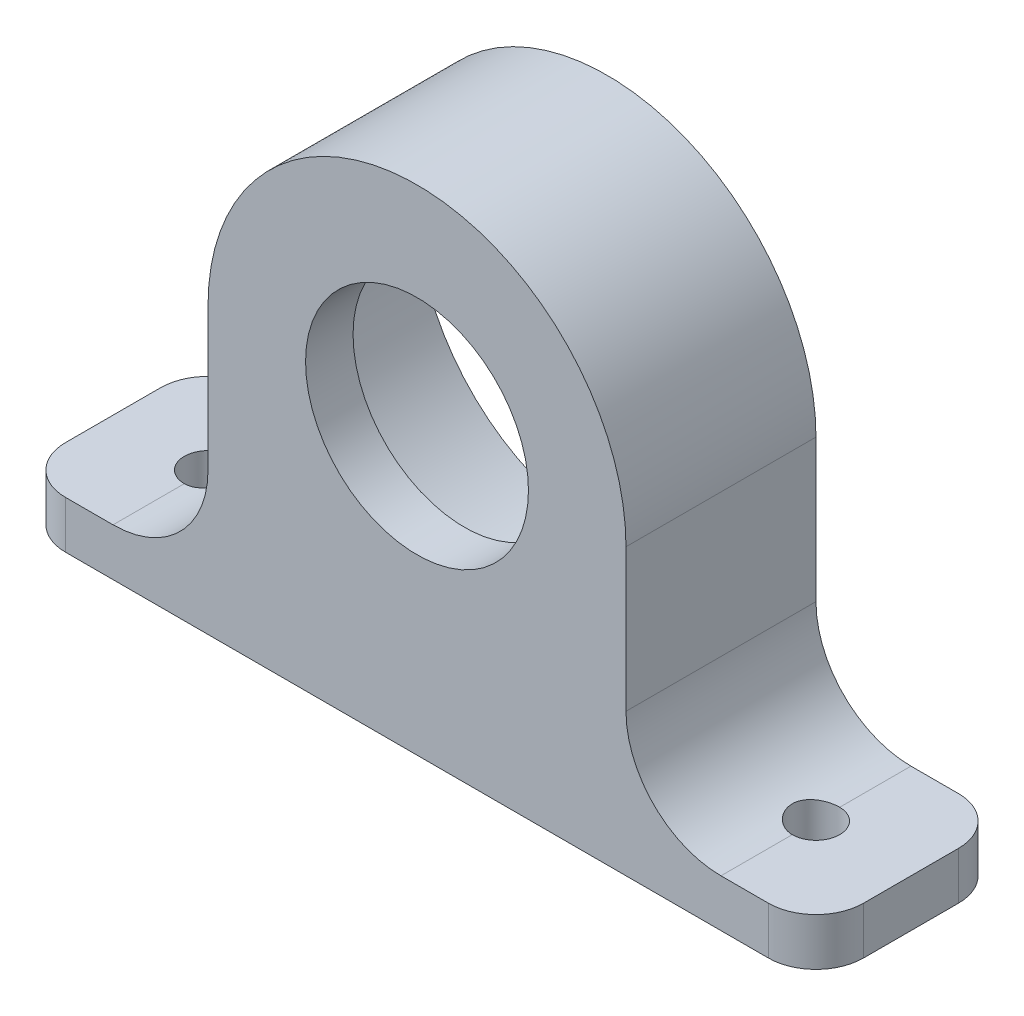
ISO-10303-21;
HEADER;
FILE_DESCRIPTION(('STEP AP214'),'2;1');
FILE_NAME('part.step','',(''),(''),'','','');
FILE_SCHEMA(('AUTOMOTIVE_DESIGN { 1 0 10303 214 1 1 1 1 }'));
ENDSEC;
DATA;
#1=APPLICATION_CONTEXT('core data for automotive mechanical design processes');
#2=APPLICATION_PROTOCOL_DEFINITION('international standard','automotive_design',2000,#1);
#3=PRODUCT_CONTEXT('',#1,'mechanical');
#4=PRODUCT('Part','Part','',(#3));
#5=PRODUCT_RELATED_PRODUCT_CATEGORY('part','',(#4));
#6=PRODUCT_DEFINITION_FORMATION('','',#4);
#7=PRODUCT_DEFINITION_CONTEXT('part definition',#1,'design');
#8=PRODUCT_DEFINITION('design','',#6,#7);
#9=PRODUCT_DEFINITION_SHAPE('','',#8);
#10=(LENGTH_UNIT() NAMED_UNIT(*) SI_UNIT(.MILLI.,.METRE.));
#11=(NAMED_UNIT(*) PLANE_ANGLE_UNIT() SI_UNIT($,.RADIAN.));
#12=(NAMED_UNIT(*) SI_UNIT($,.STERADIAN.) SOLID_ANGLE_UNIT());
#13=UNCERTAINTY_MEASURE_WITH_UNIT(LENGTH_MEASURE(1.E-05),#10,'distance_accuracy_value','');
#14=(GEOMETRIC_REPRESENTATION_CONTEXT(3) GLOBAL_UNCERTAINTY_ASSIGNED_CONTEXT((#13)) GLOBAL_UNIT_ASSIGNED_CONTEXT((#10,
#11,#12)) REPRESENTATION_CONTEXT('',''));
#15=CARTESIAN_POINT('',(0.,0.,0.));
#16=DIRECTION('',(0.,0.,1.));
#17=DIRECTION('',(1.,0.,0.));
#18=AXIS2_PLACEMENT_3D('',#15,#16,#17);
#19=CARTESIAN_POINT('',(0.,30.,20.));
#20=DIRECTION('',(0.,0.,-1.));
#21=DIRECTION('',(-1.,0.,0.));
#22=AXIS2_PLACEMENT_3D('',#19,#20,#21);
#23=CYLINDRICAL_SURFACE('',#22,20.);
#24=CARTESIAN_POINT('',(0.,30.,0.));
#25=DIRECTION('',(0.,0.,1.));
#26=DIRECTION('',(1.,0.,0.));
#27=AXIS2_PLACEMENT_3D('',#24,#25,#26);
#28=CIRCLE('',#27,20.);
#29=CARTESIAN_POINT('',(20.,30.,0.));
#30=VERTEX_POINT('',#29);
#31=EDGE_CURVE('E206',#30,#30,#28,.T.);
#32=ORIENTED_EDGE('',*,*,#31,.F.);
#33=EDGE_LOOP('',(#32));
#34=FACE_BOUND('',#33,.T.);
#35=CARTESIAN_POINT('',(0.,30.,15.));
#36=DIRECTION('',(0.,0.,1.));
#37=DIRECTION('',(1.,0.,0.));
#38=AXIS2_PLACEMENT_3D('',#35,#36,#37);
#39=CIRCLE('',#38,20.);
#40=CARTESIAN_POINT('',(20.,30.,15.));
#41=VERTEX_POINT('',#40);
#42=EDGE_CURVE('E406',#41,#41,#39,.T.);
#43=ORIENTED_EDGE('',*,*,#42,.T.);
#44=EDGE_LOOP('',(#43));
#45=FACE_BOUND('',#44,.T.);
#46=ADVANCED_FACE('F51',(#34,#45),#23,.F.);
#47=CARTESIAN_POINT('',(0.,30.,20.));
#48=DIRECTION('',(0.,0.,-1.));
#49=DIRECTION('',(-1.,0.,0.));
#50=AXIS2_PLACEMENT_3D('',#47,#48,#49);
#51=PLANE('',#50);
#52=DIRECTION('',(1.,0.,0.));
#53=VECTOR('',#52,1.);
#54=CARTESIAN_POINT('',(42.,0.,20.));
#55=LINE('',#54,#53);
#56=CARTESIAN_POINT('',(-37.,0.,20.));
#57=VERTEX_POINT('',#56);
#58=CARTESIAN_POINT('',(37.,0.,20.));
#59=VERTEX_POINT('',#58);
#60=EDGE_CURVE('E201',#57,#59,#55,.T.);
#61=ORIENTED_EDGE('',*,*,#60,.T.);
#62=DIRECTION('',(0.,1.,0.));
#63=VECTOR('',#62,1.);
#64=CARTESIAN_POINT('',(37.,30.,20.));
#65=LINE('',#64,#63);
#66=CARTESIAN_POINT('',(37.,5.,20.));
#67=VERTEX_POINT('',#66);
#68=EDGE_CURVE('E11',#59,#67,#65,.T.);
#69=ORIENTED_EDGE('',*,*,#68,.T.);
#70=DIRECTION('',(-1.,0.,0.));
#71=VECTOR('',#70,1.);
#72=CARTESIAN_POINT('',(42.,5.,20.));
#73=LINE('',#72,#71);
#74=CARTESIAN_POINT('',(32.,5.,20.));
#75=VERTEX_POINT('',#74);
#76=EDGE_CURVE('E178',#67,#75,#73,.T.);
#77=ORIENTED_EDGE('',*,*,#76,.T.);
#78=CARTESIAN_POINT('',(32.,15.,20.));
#79=DIRECTION('',(0.,0.,-1.));
#80=DIRECTION('',(-1.,0.,0.));
#81=AXIS2_PLACEMENT_3D('',#78,#79,#80);
#82=CIRCLE('',#81,10.);
#83=CARTESIAN_POINT('',(22.,15.,20.));
#84=VERTEX_POINT('',#83);
#85=EDGE_CURVE('E174',#75,#84,#82,.T.);
#86=ORIENTED_EDGE('',*,*,#85,.T.);
#87=DIRECTION('',(0.,1.,0.));
#88=VECTOR('',#87,1.);
#89=CARTESIAN_POINT('',(22.,5.,20.));
#90=LINE('',#89,#88);
#91=CARTESIAN_POINT('',(22.,30.,20.));
#92=VERTEX_POINT('',#91);
#93=EDGE_CURVE('E164',#84,#92,#90,.T.);
#94=ORIENTED_EDGE('',*,*,#93,.T.);
#95=CARTESIAN_POINT('',(0.,30.,20.));
#96=DIRECTION('',(0.,0.,1.));
#97=DIRECTION('',(-1.,0.,0.));
#98=AXIS2_PLACEMENT_3D('',#95,#96,#97);
#99=CIRCLE('',#98,22.);
#100=CARTESIAN_POINT('',(-22.,30.,20.));
#101=VERTEX_POINT('',#100);
#102=EDGE_CURVE('E171',#92,#101,#99,.T.);
#103=ORIENTED_EDGE('',*,*,#102,.T.);
#104=DIRECTION('',(0.,-1.,0.));
#105=VECTOR('',#104,1.);
#106=CARTESIAN_POINT('',(-22.,4.99999999999999,20.));
#107=LINE('',#106,#105);
#108=CARTESIAN_POINT('',(-22.,15.,20.));
#109=VERTEX_POINT('',#108);
#110=EDGE_CURVE('E193',#101,#109,#107,.T.);
#111=ORIENTED_EDGE('',*,*,#110,.T.);
#112=CARTESIAN_POINT('',(-32.,15.,20.));
#113=DIRECTION('',(0.,0.,-1.));
#114=DIRECTION('',(-1.,0.,0.));
#115=AXIS2_PLACEMENT_3D('',#112,#113,#114);
#116=CIRCLE('',#115,10.);
#117=CARTESIAN_POINT('',(-32.,4.99999999999999,20.));
#118=VERTEX_POINT('',#117);
#119=EDGE_CURVE('E389',#109,#118,#116,.T.);
#120=ORIENTED_EDGE('',*,*,#119,.T.);
#121=DIRECTION('',(-1.,0.,0.));
#122=VECTOR('',#121,1.);
#123=CARTESIAN_POINT('',(-42.,4.99999999999999,20.));
#124=LINE('',#123,#122);
#125=CARTESIAN_POINT('',(-37.,4.99999999999999,20.));
#126=VERTEX_POINT('',#125);
#127=EDGE_CURVE('E195',#118,#126,#124,.T.);
#128=ORIENTED_EDGE('',*,*,#127,.T.);
#129=DIRECTION('',(0.,-1.,0.));
#130=VECTOR('',#129,1.);
#131=CARTESIAN_POINT('',(-37.,30.,20.));
#132=LINE('',#131,#130);
#133=EDGE_CURVE('E59',#126,#57,#132,.T.);
#134=ORIENTED_EDGE('',*,*,#133,.T.);
#135=EDGE_LOOP('',(#61,#69,#77,#86,#94,#103,#111,#120,#128,#134));
#136=FACE_BOUND('',#135,.T.);
#137=CARTESIAN_POINT('',(0.,30.,20.));
#138=DIRECTION('',(0.,0.,1.));
#139=DIRECTION('',(1.,0.,0.));
#140=AXIS2_PLACEMENT_3D('',#137,#138,#139);
#141=CIRCLE('',#140,11.7327485907351);
#142=CARTESIAN_POINT('',(11.7327485907351,30.,20.));
#143=VERTEX_POINT('',#142);
#144=EDGE_CURVE('E560',#143,#143,#141,.T.);
#145=ORIENTED_EDGE('',*,*,#144,.F.);
#146=EDGE_LOOP('',(#145));
#147=FACE_BOUND('',#146,.T.);
#148=ADVANCED_FACE('F167',(#136,#147),#51,.F.);
#149=CARTESIAN_POINT('',(0.,30.,0.));
#150=DIRECTION('',(0.,0.,-1.));
#151=DIRECTION('',(-1.,0.,0.));
#152=AXIS2_PLACEMENT_3D('',#149,#150,#151);
#153=PLANE('',#152);
#154=DIRECTION('',(1.,0.,0.));
#155=VECTOR('',#154,1.);
#156=CARTESIAN_POINT('',(42.,0.,0.));
#157=LINE('',#156,#155);
#158=CARTESIAN_POINT('',(-37.,0.,0.));
#159=VERTEX_POINT('',#158);
#160=CARTESIAN_POINT('',(37.,0.,0.));
#161=VERTEX_POINT('',#160);
#162=EDGE_CURVE('E216',#159,#161,#157,.T.);
#163=ORIENTED_EDGE('',*,*,#162,.F.);
#164=DIRECTION('',(0.,-1.,0.));
#165=VECTOR('',#164,1.);
#166=CARTESIAN_POINT('',(-37.,4.99999999999999,0.));
#167=LINE('',#166,#165);
#168=CARTESIAN_POINT('',(-37.,4.99999999999999,0.));
#169=VERTEX_POINT('',#168);
#170=EDGE_CURVE('E384',#159,#169,#167,.F.);
#171=ORIENTED_EDGE('',*,*,#170,.T.);
#172=DIRECTION('',(-1.,0.,0.));
#173=VECTOR('',#172,1.);
#174=CARTESIAN_POINT('',(-42.,4.99999999999999,0.));
#175=LINE('',#174,#173);
#176=CARTESIAN_POINT('',(-32.,4.99999999999999,0.));
#177=VERTEX_POINT('',#176);
#178=EDGE_CURVE('E213',#177,#169,#175,.T.);
#179=ORIENTED_EDGE('',*,*,#178,.F.);
#180=CARTESIAN_POINT('',(-32.,15.,0.));
#181=DIRECTION('',(0.,0.,-1.));
#182=DIRECTION('',(-1.,0.,0.));
#183=AXIS2_PLACEMENT_3D('',#180,#181,#182);
#184=CIRCLE('',#183,10.);
#185=CARTESIAN_POINT('',(-22.,15.,0.));
#186=VERTEX_POINT('',#185);
#187=EDGE_CURVE('E289',#177,#186,#184,.F.);
#188=ORIENTED_EDGE('',*,*,#187,.T.);
#189=DIRECTION('',(0.,-1.,0.));
#190=VECTOR('',#189,1.);
#191=CARTESIAN_POINT('',(-22.,4.99999999999999,0.));
#192=LINE('',#191,#190);
#193=CARTESIAN_POINT('',(-22.,30.,0.));
#194=VERTEX_POINT('',#193);
#195=EDGE_CURVE('E210',#194,#186,#192,.T.);
#196=ORIENTED_EDGE('',*,*,#195,.F.);
#197=CARTESIAN_POINT('',(0.,30.,0.));
#198=DIRECTION('',(0.,0.,1.));
#199=DIRECTION('',(-1.,0.,0.));
#200=AXIS2_PLACEMENT_3D('',#197,#198,#199);
#201=CIRCLE('',#200,22.);
#202=CARTESIAN_POINT('',(22.,30.,0.));
#203=VERTEX_POINT('',#202);
#204=EDGE_CURVE('E208',#203,#194,#201,.T.);
#205=ORIENTED_EDGE('',*,*,#204,.F.);
#206=DIRECTION('',(0.,1.,0.));
#207=VECTOR('',#206,1.);
#208=CARTESIAN_POINT('',(22.,5.,0.));
#209=LINE('',#208,#207);
#210=CARTESIAN_POINT('',(22.,15.,0.));
#211=VERTEX_POINT('',#210);
#212=EDGE_CURVE('E184',#211,#203,#209,.T.);
#213=ORIENTED_EDGE('',*,*,#212,.F.);
#214=CARTESIAN_POINT('',(32.,15.,0.));
#215=DIRECTION('',(0.,0.,-1.));
#216=DIRECTION('',(-1.,0.,0.));
#217=AXIS2_PLACEMENT_3D('',#214,#215,#216);
#218=CIRCLE('',#217,10.);
#219=CARTESIAN_POINT('',(32.,5.,0.));
#220=VERTEX_POINT('',#219);
#221=EDGE_CURVE('E251',#211,#220,#218,.F.);
#222=ORIENTED_EDGE('',*,*,#221,.T.);
#223=DIRECTION('',(-1.,0.,0.));
#224=VECTOR('',#223,1.);
#225=CARTESIAN_POINT('',(42.,5.,0.));
#226=LINE('',#225,#224);
#227=CARTESIAN_POINT('',(37.,5.,0.));
#228=VERTEX_POINT('',#227);
#229=EDGE_CURVE('E204',#228,#220,#226,.T.);
#230=ORIENTED_EDGE('',*,*,#229,.F.);
#231=DIRECTION('',(0.,1.,0.));
#232=VECTOR('',#231,1.);
#233=CARTESIAN_POINT('',(37.,0.,0.));
#234=LINE('',#233,#232);
#235=EDGE_CURVE('E382',#228,#161,#234,.F.);
#236=ORIENTED_EDGE('',*,*,#235,.T.);
#237=EDGE_LOOP('',(#163,#171,#179,#188,#196,#205,#213,#222,#230,#236));
#238=FACE_BOUND('',#237,.T.);
#239=ORIENTED_EDGE('',*,*,#31,.T.);
#240=EDGE_LOOP('',(#239));
#241=FACE_BOUND('',#240,.T.);
#242=ADVANCED_FACE('F311',(#238,#241),#153,.T.);
#243=CARTESIAN_POINT('',(42.,5.,20.));
#244=DIRECTION('',(0.,-1.,0.));
#245=DIRECTION('',(1.,0.,0.));
#246=AXIS2_PLACEMENT_3D('',#243,#244,#245);
#247=PLANE('',#246);
#248=DIRECTION('',(0.,0.,-1.));
#249=VECTOR('',#248,1.);
#250=CARTESIAN_POINT('',(42.,5.,20.));
#251=LINE('',#250,#249);
#252=CARTESIAN_POINT('',(42.,5.,15.));
#253=VERTEX_POINT('',#252);
#254=CARTESIAN_POINT('',(42.,5.,5.));
#255=VERTEX_POINT('',#254);
#256=EDGE_CURVE('E203',#253,#255,#251,.T.);
#257=ORIENTED_EDGE('',*,*,#256,.T.);
#258=CARTESIAN_POINT('',(37.,5.,5.));
#259=DIRECTION('',(0.,-1.,0.));
#260=DIRECTION('',(1.,0.,0.));
#261=AXIS2_PLACEMENT_3D('',#258,#259,#260);
#262=CIRCLE('',#261,5.);
#263=EDGE_CURVE('E73',#255,#228,#262,.F.);
#264=ORIENTED_EDGE('',*,*,#263,.T.);
#265=ORIENTED_EDGE('',*,*,#229,.T.);
#266=DIRECTION('',(0.,0.,-1.));
#267=VECTOR('',#266,1.);
#268=CARTESIAN_POINT('',(32.,5.,20.));
#269=LINE('',#268,#267);
#270=CARTESIAN_POINT('',(32.,5.,7.49999999999999));
#271=VERTEX_POINT('',#270);
#272=EDGE_CURVE('E242',#220,#271,#269,.F.);
#273=ORIENTED_EDGE('',*,*,#272,.T.);
#274=CARTESIAN_POINT('',(32.,5.,9.99999999999999));
#275=DIRECTION('',(0.,1.,0.));
#276=DIRECTION('',(1.,0.,0.));
#277=AXIS2_PLACEMENT_3D('',#274,#275,#276);
#278=CIRCLE('',#277,2.5);
#279=CARTESIAN_POINT('',(32.,5.,12.5));
#280=VERTEX_POINT('',#279);
#281=EDGE_CURVE('E403',#280,#271,#278,.T.);
#282=ORIENTED_EDGE('',*,*,#281,.F.);
#283=DIRECTION('',(0.,0.,-1.));
#284=VECTOR('',#283,1.);
#285=CARTESIAN_POINT('',(32.,5.,20.));
#286=LINE('',#285,#284);
#287=EDGE_CURVE('E239',#280,#75,#286,.F.);
#288=ORIENTED_EDGE('',*,*,#287,.T.);
#289=ORIENTED_EDGE('',*,*,#76,.F.);
#290=CARTESIAN_POINT('',(37.,5.,15.));
#291=DIRECTION('',(0.,-1.,0.));
#292=DIRECTION('',(1.,0.,0.));
#293=AXIS2_PLACEMENT_3D('',#290,#291,#292);
#294=CIRCLE('',#293,5.);
#295=EDGE_CURVE('E66',#67,#253,#294,.F.);
#296=ORIENTED_EDGE('',*,*,#295,.T.);
#297=EDGE_LOOP('',(#257,#264,#265,#273,#282,#288,#289,#296));
#298=FACE_BOUND('',#297,.T.);
#299=ADVANCED_FACE('F275',(#298),#247,.F.);
#300=CARTESIAN_POINT('',(22.,5.,20.));
#301=DIRECTION('',(-1.,0.,0.));
#302=DIRECTION('',(0.,0.,1.));
#303=AXIS2_PLACEMENT_3D('',#300,#301,#302);
#304=PLANE('',#303);
#305=ORIENTED_EDGE('',*,*,#93,.F.);
#306=DIRECTION('',(0.,0.,-1.));
#307=VECTOR('',#306,1.);
#308=CARTESIAN_POINT('',(22.,15.,0.));
#309=LINE('',#308,#307);
#310=EDGE_CURVE('E187',#84,#211,#309,.T.);
#311=ORIENTED_EDGE('',*,*,#310,.T.);
#312=ORIENTED_EDGE('',*,*,#212,.T.);
#313=DIRECTION('',(0.,0.,-1.));
#314=VECTOR('',#313,1.);
#315=CARTESIAN_POINT('',(22.,30.,20.));
#316=LINE('',#315,#314);
#317=EDGE_CURVE('E181',#92,#203,#316,.T.);
#318=ORIENTED_EDGE('',*,*,#317,.F.);
#319=EDGE_LOOP('',(#305,#311,#312,#318));
#320=FACE_BOUND('',#319,.T.);
#321=ADVANCED_FACE('F182',(#320),#304,.F.);
#322=CARTESIAN_POINT('',(0.,30.,20.));
#323=DIRECTION('',(0.,0.,-1.));
#324=DIRECTION('',(-1.,0.,0.));
#325=AXIS2_PLACEMENT_3D('',#322,#323,#324);
#326=CYLINDRICAL_SURFACE('',#325,22.);
#327=ORIENTED_EDGE('',*,*,#204,.T.);
#328=DIRECTION('',(0.,0.,-1.));
#329=VECTOR('',#328,1.);
#330=CARTESIAN_POINT('',(-22.,30.,20.));
#331=LINE('',#330,#329);
#332=EDGE_CURVE('E188',#101,#194,#331,.T.);
#333=ORIENTED_EDGE('',*,*,#332,.F.);
#334=ORIENTED_EDGE('',*,*,#102,.F.);
#335=ORIENTED_EDGE('',*,*,#317,.T.);
#336=EDGE_LOOP('',(#327,#333,#334,#335));
#337=FACE_BOUND('',#336,.T.);
#338=ADVANCED_FACE('F190',(#337),#326,.T.);
#339=CARTESIAN_POINT('',(-22.,4.99999999999999,20.));
#340=DIRECTION('',(1.,0.,0.));
#341=DIRECTION('',(0.,1.,0.));
#342=AXIS2_PLACEMENT_3D('',#339,#340,#341);
#343=PLANE('',#342);
#344=ORIENTED_EDGE('',*,*,#195,.T.);
#345=DIRECTION('',(0.,0.,-1.));
#346=VECTOR('',#345,1.);
#347=CARTESIAN_POINT('',(-22.,15.,20.));
#348=LINE('',#347,#346);
#349=EDGE_CURVE('E249',#186,#109,#348,.F.);
#350=ORIENTED_EDGE('',*,*,#349,.T.);
#351=ORIENTED_EDGE('',*,*,#110,.F.);
#352=ORIENTED_EDGE('',*,*,#332,.T.);
#353=EDGE_LOOP('',(#344,#350,#351,#352));
#354=FACE_BOUND('',#353,.T.);
#355=ADVANCED_FACE('F334',(#354),#343,.F.);
#356=CARTESIAN_POINT('',(-42.,4.99999999999999,20.));
#357=DIRECTION('',(0.,-1.,0.));
#358=DIRECTION('',(1.,0.,0.));
#359=AXIS2_PLACEMENT_3D('',#356,#357,#358);
#360=PLANE('',#359);
#361=ORIENTED_EDGE('',*,*,#178,.T.);
#362=CARTESIAN_POINT('',(-37.,4.99999999999999,5.));
#363=DIRECTION('',(0.,-1.,0.));
#364=DIRECTION('',(1.,0.,0.));
#365=AXIS2_PLACEMENT_3D('',#362,#363,#364);
#366=CIRCLE('',#365,5.);
#367=CARTESIAN_POINT('',(-42.,4.99999999999999,5.));
#368=VERTEX_POINT('',#367);
#369=EDGE_CURVE('E356',#169,#368,#366,.F.);
#370=ORIENTED_EDGE('',*,*,#369,.T.);
#371=DIRECTION('',(0.,0.,-1.));
#372=VECTOR('',#371,1.);
#373=CARTESIAN_POINT('',(-42.,4.99999999999999,20.));
#374=LINE('',#373,#372);
#375=CARTESIAN_POINT('',(-42.,4.99999999999999,15.));
#376=VERTEX_POINT('',#375);
#377=EDGE_CURVE('E227',#376,#368,#374,.T.);
#378=ORIENTED_EDGE('',*,*,#377,.F.);
#379=CARTESIAN_POINT('',(-37.,4.99999999999999,15.));
#380=DIRECTION('',(0.,-1.,0.));
#381=DIRECTION('',(1.,0.,0.));
#382=AXIS2_PLACEMENT_3D('',#379,#380,#381);
#383=CIRCLE('',#382,5.);
#384=EDGE_CURVE('E359',#376,#126,#383,.F.);
#385=ORIENTED_EDGE('',*,*,#384,.T.);
#386=ORIENTED_EDGE('',*,*,#127,.F.);
#387=DIRECTION('',(0.,0.,-1.));
#388=VECTOR('',#387,1.);
#389=CARTESIAN_POINT('',(-32.,4.99999999999999,0.));
#390=LINE('',#389,#388);
#391=CARTESIAN_POINT('',(-32.,4.99999999999999,12.5));
#392=VERTEX_POINT('',#391);
#393=EDGE_CURVE('E246',#118,#392,#390,.T.);
#394=ORIENTED_EDGE('',*,*,#393,.T.);
#395=CARTESIAN_POINT('',(-32.,4.99999999999999,10.));
#396=DIRECTION('',(0.,1.,0.));
#397=DIRECTION('',(-1.,0.,0.));
#398=AXIS2_PLACEMENT_3D('',#395,#396,#397);
#399=CIRCLE('',#398,2.5);
#400=CARTESIAN_POINT('',(-32.,4.99999999999999,7.5));
#401=VERTEX_POINT('',#400);
#402=EDGE_CURVE('E235',#401,#392,#399,.T.);
#403=ORIENTED_EDGE('',*,*,#402,.F.);
#404=DIRECTION('',(0.,0.,-1.));
#405=VECTOR('',#404,1.);
#406=CARTESIAN_POINT('',(-32.,4.99999999999999,0.));
#407=LINE('',#406,#405);
#408=EDGE_CURVE('E244',#401,#177,#407,.T.);
#409=ORIENTED_EDGE('',*,*,#408,.T.);
#410=EDGE_LOOP('',(#361,#370,#378,#385,#386,#394,#403,#409));
#411=FACE_BOUND('',#410,.T.);
#412=ADVANCED_FACE('F330',(#411),#360,.F.);
#413=CARTESIAN_POINT('',(-42.,0.,20.));
#414=DIRECTION('',(1.,0.,0.));
#415=DIRECTION('',(0.,0.,-1.));
#416=AXIS2_PLACEMENT_3D('',#413,#414,#415);
#417=PLANE('',#416);
#418=ORIENTED_EDGE('',*,*,#377,.T.);
#419=DIRECTION('',(0.,-1.,0.));
#420=VECTOR('',#419,1.);
#421=CARTESIAN_POINT('',(-42.,0.,5.));
#422=LINE('',#421,#420);
#423=CARTESIAN_POINT('',(-42.,0.,5.));
#424=VERTEX_POINT('',#423);
#425=EDGE_CURVE('E377',#368,#424,#422,.T.);
#426=ORIENTED_EDGE('',*,*,#425,.T.);
#427=DIRECTION('',(0.,0.,-1.));
#428=VECTOR('',#427,1.);
#429=CARTESIAN_POINT('',(-42.,0.,20.));
#430=LINE('',#429,#428);
#431=CARTESIAN_POINT('',(-42.,0.,15.));
#432=VERTEX_POINT('',#431);
#433=EDGE_CURVE('E224',#432,#424,#430,.T.);
#434=ORIENTED_EDGE('',*,*,#433,.F.);
#435=DIRECTION('',(0.,-1.,0.));
#436=VECTOR('',#435,1.);
#437=CARTESIAN_POINT('',(-42.,0.,15.));
#438=LINE('',#437,#436);
#439=EDGE_CURVE('E388',#432,#376,#438,.F.);
#440=ORIENTED_EDGE('',*,*,#439,.T.);
#441=EDGE_LOOP('',(#418,#426,#434,#440));
#442=FACE_BOUND('',#441,.T.);
#443=ADVANCED_FACE('F326',(#442),#417,.F.);
#444=CARTESIAN_POINT('',(42.,0.,20.));
#445=DIRECTION('',(0.,1.,0.));
#446=DIRECTION('',(-1.,0.,0.));
#447=AXIS2_PLACEMENT_3D('',#444,#445,#446);
#448=PLANE('',#447);
#449=CARTESIAN_POINT('',(-32.,0.,10.));
#450=DIRECTION('',(0.,1.,0.));
#451=DIRECTION('',(-1.,0.,0.));
#452=AXIS2_PLACEMENT_3D('',#449,#450,#451);
#453=CIRCLE('',#452,2.5);
#454=CARTESIAN_POINT('',(-34.5,0.,10.));
#455=VERTEX_POINT('',#454);
#456=EDGE_CURVE('E234',#455,#455,#453,.T.);
#457=ORIENTED_EDGE('',*,*,#456,.T.);
#458=EDGE_LOOP('',(#457));
#459=FACE_BOUND('',#458,.T.);
#460=CARTESIAN_POINT('',(32.,0.,9.99999999999999));
#461=DIRECTION('',(0.,1.,0.));
#462=DIRECTION('',(-1.,0.,0.));
#463=AXIS2_PLACEMENT_3D('',#460,#461,#462);
#464=CIRCLE('',#463,2.5);
#465=CARTESIAN_POINT('',(29.5,0.,9.99999999999999));
#466=VERTEX_POINT('',#465);
#467=EDGE_CURVE('E231',#466,#466,#464,.T.);
#468=ORIENTED_EDGE('',*,*,#467,.T.);
#469=EDGE_LOOP('',(#468));
#470=FACE_BOUND('',#469,.T.);
#471=ORIENTED_EDGE('',*,*,#433,.T.);
#472=CARTESIAN_POINT('',(-37.,0.,5.));
#473=DIRECTION('',(0.,1.,0.));
#474=DIRECTION('',(-1.,0.,0.));
#475=AXIS2_PLACEMENT_3D('',#472,#473,#474);
#476=CIRCLE('',#475,5.);
#477=EDGE_CURVE('E375',#424,#159,#476,.F.);
#478=ORIENTED_EDGE('',*,*,#477,.T.);
#479=ORIENTED_EDGE('',*,*,#162,.T.);
#480=CARTESIAN_POINT('',(37.,0.,5.));
#481=DIRECTION('',(0.,1.,0.));
#482=DIRECTION('',(-1.,0.,0.));
#483=AXIS2_PLACEMENT_3D('',#480,#481,#482);
#484=CIRCLE('',#483,5.);
#485=CARTESIAN_POINT('',(42.,0.,5.));
#486=VERTEX_POINT('',#485);
#487=EDGE_CURVE('E373',#161,#486,#484,.F.);
#488=ORIENTED_EDGE('',*,*,#487,.T.);
#489=DIRECTION('',(0.,0.,-1.));
#490=VECTOR('',#489,1.);
#491=CARTESIAN_POINT('',(42.,0.,20.));
#492=LINE('',#491,#490);
#493=CARTESIAN_POINT('',(42.,0.,15.));
#494=VERTEX_POINT('',#493);
#495=EDGE_CURVE('E221',#494,#486,#492,.T.);
#496=ORIENTED_EDGE('',*,*,#495,.F.);
#497=CARTESIAN_POINT('',(37.,0.,15.));
#498=DIRECTION('',(0.,1.,0.));
#499=DIRECTION('',(-1.,0.,0.));
#500=AXIS2_PLACEMENT_3D('',#497,#498,#499);
#501=CIRCLE('',#500,5.);
#502=EDGE_CURVE('E355',#494,#59,#501,.F.);
#503=ORIENTED_EDGE('',*,*,#502,.T.);
#504=ORIENTED_EDGE('',*,*,#60,.F.);
#505=CARTESIAN_POINT('',(-37.,0.,15.));
#506=DIRECTION('',(0.,1.,0.));
#507=DIRECTION('',(-1.,0.,0.));
#508=AXIS2_PLACEMENT_3D('',#505,#506,#507);
#509=CIRCLE('',#508,5.);
#510=EDGE_CURVE('E371',#57,#432,#509,.F.);
#511=ORIENTED_EDGE('',*,*,#510,.T.);
#512=EDGE_LOOP('',(#471,#478,#479,#488,#496,#503,#504,#511));
#513=FACE_BOUND('',#512,.T.);
#514=ADVANCED_FACE('F322',(#459,#470,#513),#448,.F.);
#515=CARTESIAN_POINT('',(42.,0.,20.));
#516=DIRECTION('',(-1.,0.,0.));
#517=DIRECTION('',(0.,0.,1.));
#518=AXIS2_PLACEMENT_3D('',#515,#516,#517);
#519=PLANE('',#518);
#520=ORIENTED_EDGE('',*,*,#495,.T.);
#521=DIRECTION('',(0.,1.,0.));
#522=VECTOR('',#521,1.);
#523=CARTESIAN_POINT('',(42.,5.,5.));
#524=LINE('',#523,#522);
#525=EDGE_CURVE('E352',#486,#255,#524,.T.);
#526=ORIENTED_EDGE('',*,*,#525,.T.);
#527=ORIENTED_EDGE('',*,*,#256,.F.);
#528=DIRECTION('',(0.,1.,0.));
#529=VECTOR('',#528,1.);
#530=CARTESIAN_POINT('',(42.,0.,15.));
#531=LINE('',#530,#529);
#532=EDGE_CURVE('E350',#253,#494,#531,.F.);
#533=ORIENTED_EDGE('',*,*,#532,.T.);
#534=EDGE_LOOP('',(#520,#526,#527,#533));
#535=FACE_BOUND('',#534,.T.);
#536=ADVANCED_FACE('F319',(#535),#519,.F.);
#537=CARTESIAN_POINT('',(32.,-10.,9.99999999999999));
#538=DIRECTION('',(0.,1.,0.));
#539=DIRECTION('',(-1.,0.,0.));
#540=AXIS2_PLACEMENT_3D('',#537,#538,#539);
#541=CYLINDRICAL_SURFACE('',#540,2.5);
#542=ORIENTED_EDGE('',*,*,#281,.T.);
#543=CARTESIAN_POINT('',(32.,5.,7.49999999999999));
#544=CARTESIAN_POINT('',(31.9308280168792,4.99999317151491,7.49999207155215));
#545=CARTESIAN_POINT('',(31.8616605925883,5.00071756106084,7.50287074477728));
#546=CARTESIAN_POINT('',(31.7238407576271,5.0035781282468,7.51433978820841));
#547=CARTESIAN_POINT('',(31.6551882685381,5.00571408631721,7.52292927009874));
#548=CARTESIAN_POINT('',(31.5190118297973,5.01134182201417,7.54573677857047));
#549=CARTESIAN_POINT('',(31.4514859842449,5.01483101664135,7.55994408309907));
#550=CARTESIAN_POINT('',(31.3179261069828,5.0230635483324,7.59385602431219));
#551=CARTESIAN_POINT('',(31.2518920911121,5.02780689870508,7.61356071933388));
#552=CARTESIAN_POINT('',(31.0567235262492,5.04373608306462,7.68070840819371));
#553=CARTESIAN_POINT('',(30.930393647928,5.05662672964088,7.73620677431151));
#554=CARTESIAN_POINT('',(30.6888816264023,5.0855750588633,7.86695916042344));
#555=CARTESIAN_POINT('',(30.573702079602,5.1016334765073,7.94221776660488));
#556=CARTESIAN_POINT('',(30.3553399952552,5.13554229441742,8.1119967260107));
#557=CARTESIAN_POINT('',(30.2524163852587,5.15342017025146,8.20684518989344));
#558=CARTESIAN_POINT('',(30.0637566180564,5.18877174568775,8.41241248605537));
#559=CARTESIAN_POINT('',(29.9780236780696,5.20624536909422,8.52313428237789));
#560=CARTESIAN_POINT('',(29.8249541965666,5.23908748515696,8.75932834430002));
#561=CARTESIAN_POINT('',(29.7579096318992,5.2544208777927,8.88499517438719));
#562=CARTESIAN_POINT('',(29.6460027224038,5.28084233007127,9.14625436998782));
#563=CARTESIAN_POINT('',(29.6011356929472,5.29193128616761,9.28184463239121));
#564=CARTESIAN_POINT('',(29.5357423360635,5.3083252951723,9.55623761492637));
#565=CARTESIAN_POINT('',(29.5147467009528,5.31374169488976,9.69492168102767));
#566=CARTESIAN_POINT('',(29.4962303130459,5.31851063938899,9.97394443834748));
#567=CARTESIAN_POINT('',(29.4987062708209,5.31786403387138,10.1142828949581));
#568=CARTESIAN_POINT('',(29.5266891871176,5.31067989220184,10.3890269570858));
#569=CARTESIAN_POINT('',(29.5516363159903,5.30428555858343,10.523493911289));
#570=CARTESIAN_POINT('',(29.6229601133261,5.2865547374778,10.7862695713833));
#571=CARTESIAN_POINT('',(29.6693381165062,5.27521794217608,10.9145778931647));
#572=CARTESIAN_POINT('',(29.7826848380056,5.24874794469568,11.1628981578527));
#573=CARTESIAN_POINT('',(29.8498570037319,5.23357751675691,11.2828131010223));
#574=CARTESIAN_POINT('',(30.002741694207,5.20117108061935,11.5098670527906));
#575=CARTESIAN_POINT('',(30.0884570282275,5.18393475961645,11.6170041217345));
#576=CARTESIAN_POINT('',(30.2788828433389,5.1487373417171,11.8186610790886));
#577=CARTESIAN_POINT('',(30.3840637936874,5.13076956586345,11.9127360395525));
#578=CARTESIAN_POINT('',(30.608954834665,5.09657095143385,12.0820183995616));
#579=CARTESIAN_POINT('',(30.7286686509497,5.08034056027031,12.1572209457417));
#580=CARTESIAN_POINT('',(30.9798803175335,5.05136176743551,12.2867921682899));
#581=CARTESIAN_POINT('',(31.111422988102,5.03862741989027,12.3410770983701));
#582=CARTESIAN_POINT('',(31.3820788076658,5.01819170452745,12.4265704687375));
#583=CARTESIAN_POINT('',(31.5211805459468,5.01048296709057,12.4578127079981));
#584=CARTESIAN_POINT('',(31.7179030401038,5.00382055469345,12.4846810756458));
#585=CARTESIAN_POINT('',(31.7742072759816,5.00238974825735,12.4904267820569));
#586=CARTESIAN_POINT('',(31.8869987733738,5.0004799903954,12.498081882109));
#587=CARTESIAN_POINT('',(31.9434855802572,4.99999947397288,12.4999975832977));
#588=CARTESIAN_POINT('',(32.,5.,12.5));
#589=B_SPLINE_CURVE_WITH_KNOTS('',3,(#543,#544,#545,#546,#547,#548,#549,#550,#551,#552,#553,
#554,#555,#556,#557,#558,#559,#560,#561,#562,#563,#564,#565,#566,#567,#568,#569,#570,#571,#572,
#573,#574,#575,#576,#577,#578,#579,#580,#581,#582,#583,#584,#585,#586,#587,#588),.UNSPECIFIED.,
.F.,.F.,(4,2,2,2,2,2,2,2,2,2,2,2,2,2,2,2,2,2,2,2,2,2,4),(0.,0.207444392168171,0.414856523930354,
0.621874689521052,0.828895052029222,1.24254842673381,1.65629789193884,2.07763963139779,
2.4990601511503,2.92673643717075,3.35432234517622,3.77334818145837,4.19231529419042,
4.6011247733478,5.00995971663059,5.42292830716784,5.83595950590656,6.26072493222844,
6.68559948258473,7.1121578222439,7.53808923584229,7.70782285938572,7.87727672149718),.UNSPECIFIED.);
#590=EDGE_CURVE('E254',#271,#280,#589,.T.);
#591=ORIENTED_EDGE('',*,*,#590,.T.);
#592=EDGE_LOOP('',(#542,#591));
#593=FACE_BOUND('',#592,.T.);
#594=ORIENTED_EDGE('',*,*,#467,.F.);
#595=EDGE_LOOP('',(#594));
#596=FACE_BOUND('',#595,.T.);
#597=ADVANCED_FACE('F263',(#593,#596),#541,.F.);
#598=CARTESIAN_POINT('',(-32.,-10.,10.));
#599=DIRECTION('',(0.,1.,0.));
#600=DIRECTION('',(-1.,0.,0.));
#601=AXIS2_PLACEMENT_3D('',#598,#599,#600);
#602=CYLINDRICAL_SURFACE('',#601,2.5);
#603=ORIENTED_EDGE('',*,*,#402,.T.);
#604=CARTESIAN_POINT('',(-32.,4.99999999999999,12.5));
#605=CARTESIAN_POINT('',(-31.9308280168792,4.99999317151491,12.5000079284478));
#606=CARTESIAN_POINT('',(-31.8616605925883,5.00071756106083,12.4971292552227));
#607=CARTESIAN_POINT('',(-31.7238407576271,5.0035781282468,12.4856602117916));
#608=CARTESIAN_POINT('',(-31.6551882685381,5.0057140863172,12.4770707299013));
#609=CARTESIAN_POINT('',(-31.5190118297973,5.01134182201416,12.4542632214295));
#610=CARTESIAN_POINT('',(-31.4514859842449,5.01483101664135,12.4400559169009));
#611=CARTESIAN_POINT('',(-31.3179261069828,5.0230635483324,12.4061439756878));
#612=CARTESIAN_POINT('',(-31.2518920911121,5.02780689870507,12.3864392806661));
#613=CARTESIAN_POINT('',(-31.0567235262492,5.04373608306461,12.3192915918063));
#614=CARTESIAN_POINT('',(-30.930393647928,5.05662672964087,12.2637932256885));
#615=CARTESIAN_POINT('',(-30.6888816264023,5.08557505886329,12.1330408395766));
#616=CARTESIAN_POINT('',(-30.573702079602,5.1016334765073,12.0577822333951));
#617=CARTESIAN_POINT('',(-30.3553399952552,5.13554229441741,11.8880032739893));
#618=CARTESIAN_POINT('',(-30.2524163852587,5.15342017025145,11.7931548101066));
#619=CARTESIAN_POINT('',(-30.0637566180564,5.18877174568774,11.5875875139446));
#620=CARTESIAN_POINT('',(-29.9780236780696,5.20624536909422,11.4768657176221));
#621=CARTESIAN_POINT('',(-29.8249541965666,5.23908748515695,11.2406716557));
#622=CARTESIAN_POINT('',(-29.7579096318992,5.2544208777927,11.1150048256128));
#623=CARTESIAN_POINT('',(-29.6460027224038,5.28084233007126,10.8537456300122));
#624=CARTESIAN_POINT('',(-29.6011356929472,5.29193128616761,10.7181553676088));
#625=CARTESIAN_POINT('',(-29.5357423360635,5.30832529517229,10.4437623850736));
#626=CARTESIAN_POINT('',(-29.5147467009528,5.31374169488976,10.3050783189723));
#627=CARTESIAN_POINT('',(-29.4962303130459,5.31851063938899,10.0260555616525));
#628=CARTESIAN_POINT('',(-29.4987062708209,5.31786403387138,9.88571710504193));
#629=CARTESIAN_POINT('',(-29.5266891871176,5.31067989220183,9.61097304291422));
#630=CARTESIAN_POINT('',(-29.5516363159903,5.30428555858342,9.47650608871098));
#631=CARTESIAN_POINT('',(-29.6229601133262,5.28655473747779,9.21373042861667));
#632=CARTESIAN_POINT('',(-29.6693381165062,5.27521794217607,9.08542210683531));
#633=CARTESIAN_POINT('',(-29.7826848380056,5.24874794469568,8.83710184214728));
#634=CARTESIAN_POINT('',(-29.8498570037319,5.23357751675691,8.71718689897771));
#635=CARTESIAN_POINT('',(-30.002741694207,5.20117108061934,8.49013294720943));
#636=CARTESIAN_POINT('',(-30.0884570282275,5.18393475961644,8.38299587826547));
#637=CARTESIAN_POINT('',(-30.2788828433389,5.14873734171709,8.18133892091135));
#638=CARTESIAN_POINT('',(-30.3840637936875,5.13076956586344,8.08726396044748));
#639=CARTESIAN_POINT('',(-30.608954834665,5.09657095143385,7.91798160043838));
#640=CARTESIAN_POINT('',(-30.7286686509497,5.0803405602703,7.84277905425827));
#641=CARTESIAN_POINT('',(-30.9798803175335,5.0513617674355,7.71320783171012));
#642=CARTESIAN_POINT('',(-31.111422988102,5.03862741989027,7.65892290162988));
#643=CARTESIAN_POINT('',(-31.3820788076658,5.01819170452744,7.57342953126251));
#644=CARTESIAN_POINT('',(-31.5211805459468,5.01048296709056,7.54218729200188));
#645=CARTESIAN_POINT('',(-31.7179030401038,5.00382055469345,7.51531892435415));
#646=CARTESIAN_POINT('',(-31.7742072759816,5.00238974825734,7.50957321794307));
#647=CARTESIAN_POINT('',(-31.8869987733738,5.0004799903954,7.50191811789099));
#648=CARTESIAN_POINT('',(-31.9434855802572,4.99999947397288,7.50000241670227));
#649=CARTESIAN_POINT('',(-32.,4.99999999999999,7.49999999999998));
#650=B_SPLINE_CURVE_WITH_KNOTS('',3,(#604,#605,#606,#607,#608,#609,#610,#611,#612,#613,#614,
#615,#616,#617,#618,#619,#620,#621,#622,#623,#624,#625,#626,#627,#628,#629,#630,#631,#632,#633,
#634,#635,#636,#637,#638,#639,#640,#641,#642,#643,#644,#645,#646,#647,#648,#649),.UNSPECIFIED.,
.F.,.F.,(4,2,2,2,2,2,2,2,2,2,2,2,2,2,2,2,2,2,2,2,2,2,4),(0.,0.207444392168178,0.414856523930361,
0.621874689521052,0.828895052029222,1.24254842673381,1.65629789193884,2.07763963139779,
2.4990601511503,2.92673643717075,3.35432234517622,3.77334818145837,4.19231529419041,
4.6011247733478,5.00995971663058,5.42292830716784,5.83595950590656,6.26072493222844,
6.68559948258472,7.1121578222439,7.53808923584229,7.70782285938571,7.87727672149717),.UNSPECIFIED.);
#651=EDGE_CURVE('E283',#392,#401,#650,.T.);
#652=ORIENTED_EDGE('',*,*,#651,.T.);
#653=EDGE_LOOP('',(#603,#652));
#654=FACE_BOUND('',#653,.T.);
#655=ORIENTED_EDGE('',*,*,#456,.F.);
#656=EDGE_LOOP('',(#655));
#657=FACE_BOUND('',#656,.T.);
#658=ADVANCED_FACE('F273',(#654,#657),#602,.F.);
#659=CARTESIAN_POINT('',(32.,15.,20.));
#660=DIRECTION('',(0.,0.,1.));
#661=DIRECTION('',(1.,0.,0.));
#662=AXIS2_PLACEMENT_3D('',#659,#660,#661);
#663=CYLINDRICAL_SURFACE('',#662,10.);
#664=ORIENTED_EDGE('',*,*,#590,.F.);
#665=ORIENTED_EDGE('',*,*,#272,.F.);
#666=ORIENTED_EDGE('',*,*,#221,.F.);
#667=ORIENTED_EDGE('',*,*,#310,.F.);
#668=ORIENTED_EDGE('',*,*,#85,.F.);
#669=ORIENTED_EDGE('',*,*,#287,.F.);
#670=EDGE_LOOP('',(#664,#665,#666,#667,#668,#669));
#671=FACE_BOUND('',#670,.T.);
#672=ADVANCED_FACE('F267',(#671),#663,.F.);
#673=CARTESIAN_POINT('',(-32.,15.,20.));
#674=DIRECTION('',(0.,0.,1.));
#675=DIRECTION('',(1.,0.,0.));
#676=AXIS2_PLACEMENT_3D('',#673,#674,#675);
#677=CYLINDRICAL_SURFACE('',#676,10.);
#678=ORIENTED_EDGE('',*,*,#119,.F.);
#679=ORIENTED_EDGE('',*,*,#349,.F.);
#680=ORIENTED_EDGE('',*,*,#187,.F.);
#681=ORIENTED_EDGE('',*,*,#408,.F.);
#682=ORIENTED_EDGE('',*,*,#651,.F.);
#683=ORIENTED_EDGE('',*,*,#393,.F.);
#684=EDGE_LOOP('',(#678,#679,#680,#681,#682,#683));
#685=FACE_BOUND('',#684,.T.);
#686=ADVANCED_FACE('F272',(#685),#677,.F.);
#687=CARTESIAN_POINT('',(-37.,0.,5.));
#688=DIRECTION('',(0.,1.,0.));
#689=DIRECTION('',(0.,0.,1.));
#690=AXIS2_PLACEMENT_3D('',#687,#688,#689);
#691=CYLINDRICAL_SURFACE('',#690,5.);
#692=ORIENTED_EDGE('',*,*,#369,.F.);
#693=ORIENTED_EDGE('',*,*,#170,.F.);
#694=ORIENTED_EDGE('',*,*,#477,.F.);
#695=ORIENTED_EDGE('',*,*,#425,.F.);
#696=EDGE_LOOP('',(#692,#693,#694,#695));
#697=FACE_BOUND('',#696,.T.);
#698=ADVANCED_FACE('F280',(#697),#691,.T.);
#699=CARTESIAN_POINT('',(37.,0.,5.));
#700=DIRECTION('',(0.,-1.,0.));
#701=DIRECTION('',(0.,0.,-1.));
#702=AXIS2_PLACEMENT_3D('',#699,#700,#701);
#703=CYLINDRICAL_SURFACE('',#702,5.);
#704=ORIENTED_EDGE('',*,*,#487,.F.);
#705=ORIENTED_EDGE('',*,*,#235,.F.);
#706=ORIENTED_EDGE('',*,*,#263,.F.);
#707=ORIENTED_EDGE('',*,*,#525,.F.);
#708=EDGE_LOOP('',(#704,#705,#706,#707));
#709=FACE_BOUND('',#708,.T.);
#710=ADVANCED_FACE('F500',(#709),#703,.T.);
#711=CARTESIAN_POINT('',(37.,30.,15.));
#712=DIRECTION('',(0.,1.,0.));
#713=DIRECTION('',(0.,0.,1.));
#714=AXIS2_PLACEMENT_3D('',#711,#712,#713);
#715=CYLINDRICAL_SURFACE('',#714,5.);
#716=ORIENTED_EDGE('',*,*,#502,.F.);
#717=ORIENTED_EDGE('',*,*,#532,.F.);
#718=ORIENTED_EDGE('',*,*,#295,.F.);
#719=ORIENTED_EDGE('',*,*,#68,.F.);
#720=EDGE_LOOP('',(#716,#717,#718,#719));
#721=FACE_BOUND('',#720,.T.);
#722=ADVANCED_FACE('F354',(#721),#715,.T.);
#723=CARTESIAN_POINT('',(-37.,30.,15.));
#724=DIRECTION('',(0.,-1.,0.));
#725=DIRECTION('',(0.,0.,-1.));
#726=AXIS2_PLACEMENT_3D('',#723,#724,#725);
#727=CYLINDRICAL_SURFACE('',#726,5.);
#728=ORIENTED_EDGE('',*,*,#384,.F.);
#729=ORIENTED_EDGE('',*,*,#439,.F.);
#730=ORIENTED_EDGE('',*,*,#510,.F.);
#731=ORIENTED_EDGE('',*,*,#133,.F.);
#732=EDGE_LOOP('',(#728,#729,#730,#731));
#733=FACE_BOUND('',#732,.T.);
#734=ADVANCED_FACE('F53',(#733),#727,.T.);
#735=CARTESIAN_POINT('',(0.,30.,15.));
#736=DIRECTION('',(0.,0.,1.));
#737=DIRECTION('',(1.,0.,0.));
#738=AXIS2_PLACEMENT_3D('',#735,#736,#737);
#739=PLANE('',#738);
#740=CARTESIAN_POINT('',(0.,30.,15.));
#741=DIRECTION('',(0.,0.,1.));
#742=DIRECTION('',(1.,0.,0.));
#743=AXIS2_PLACEMENT_3D('',#740,#741,#742);
#744=CIRCLE('',#743,11.7327485907351);
#745=CARTESIAN_POINT('',(11.7327485907351,30.,15.));
#746=VERTEX_POINT('',#745);
#747=EDGE_CURVE('E559',#746,#746,#744,.T.);
#748=ORIENTED_EDGE('',*,*,#747,.T.);
#749=EDGE_LOOP('',(#748));
#750=FACE_BOUND('',#749,.T.);
#751=ORIENTED_EDGE('',*,*,#42,.F.);
#752=EDGE_LOOP('',(#751));
#753=FACE_BOUND('',#752,.T.);
#754=ADVANCED_FACE('F295',(#750,#753),#739,.F.);
#755=CARTESIAN_POINT('',(0.,30.,15.));
#756=DIRECTION('',(0.,0.,1.));
#757=DIRECTION('',(1.,0.,0.));
#758=AXIS2_PLACEMENT_3D('',#755,#756,#757);
#759=CYLINDRICAL_SURFACE('',#758,11.7327485907351);
#760=ORIENTED_EDGE('',*,*,#747,.F.);
#761=EDGE_LOOP('',(#760));
#762=FACE_BOUND('',#761,.T.);
#763=ORIENTED_EDGE('',*,*,#144,.T.);
#764=EDGE_LOOP('',(#763));
#765=FACE_BOUND('',#764,.T.);
#766=ADVANCED_FACE('F298',(#762,#765),#759,.F.);
#767=CLOSED_SHELL('',(#46,#148,#242,#299,#321,#338,#355,#412,#443,#514,#536,#597,#658,#672,#686,
#698,#710,#722,#734,#754,#766));
#768=MANIFOLD_SOLID_BREP('B2',#767);
#769=ADVANCED_BREP_SHAPE_REPRESENTATION('',(#18,#768),#14);
#770=SHAPE_DEFINITION_REPRESENTATION(#9,#769);
ENDSEC;
END-ISO-10303-21;
